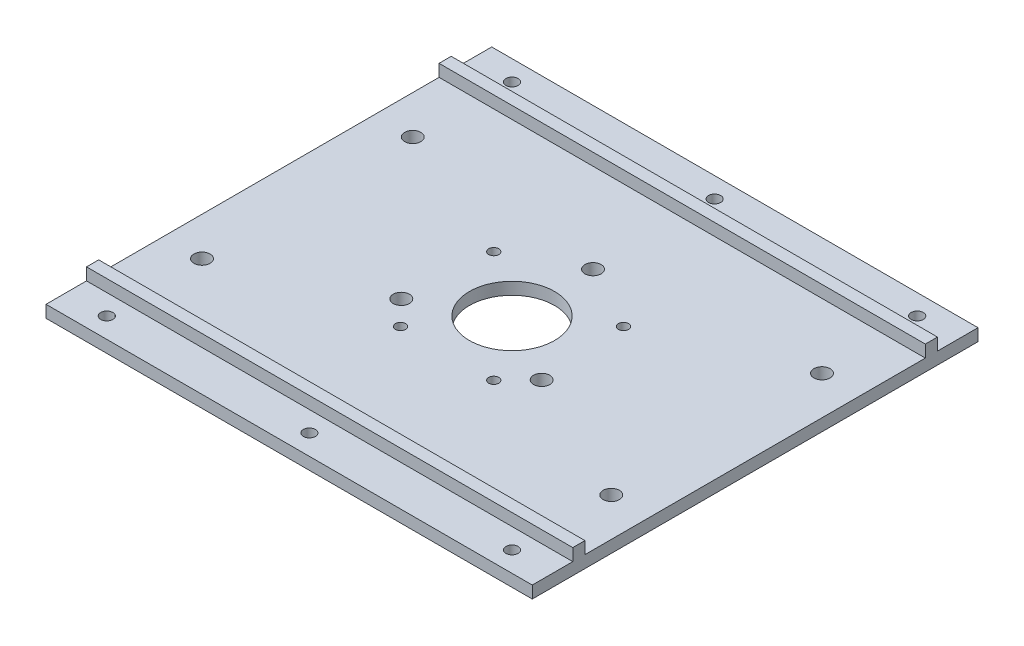
ISO-10303-21;
HEADER;
FILE_DESCRIPTION(('STEP AP214'),'2;1');
FILE_NAME('part.step','',(''),(''),'','','');
FILE_SCHEMA(('AUTOMOTIVE_DESIGN { 1 0 10303 214 1 1 1 1 }'));
ENDSEC;
DATA;
#1=APPLICATION_CONTEXT('core data for automotive mechanical design processes');
#2=APPLICATION_PROTOCOL_DEFINITION('international standard','automotive_design',2000,#1);
#3=PRODUCT_CONTEXT('',#1,'mechanical');
#4=PRODUCT('Part','Part','',(#3));
#5=PRODUCT_RELATED_PRODUCT_CATEGORY('part','',(#4));
#6=PRODUCT_DEFINITION_FORMATION('','',#4);
#7=PRODUCT_DEFINITION_CONTEXT('part definition',#1,'design');
#8=PRODUCT_DEFINITION('design','',#6,#7);
#9=PRODUCT_DEFINITION_SHAPE('','',#8);
#10=(LENGTH_UNIT() NAMED_UNIT(*) SI_UNIT(.MILLI.,.METRE.));
#11=(NAMED_UNIT(*) PLANE_ANGLE_UNIT() SI_UNIT($,.RADIAN.));
#12=(NAMED_UNIT(*) SI_UNIT($,.STERADIAN.) SOLID_ANGLE_UNIT());
#13=UNCERTAINTY_MEASURE_WITH_UNIT(LENGTH_MEASURE(1.E-05),#10,'distance_accuracy_value','');
#14=(GEOMETRIC_REPRESENTATION_CONTEXT(3) GLOBAL_UNCERTAINTY_ASSIGNED_CONTEXT((#13)) GLOBAL_UNIT_ASSIGNED_CONTEXT((#10,
#11,#12)) REPRESENTATION_CONTEXT('',''));
#15=CARTESIAN_POINT('',(0.,0.,0.));
#16=DIRECTION('',(0.,0.,1.));
#17=DIRECTION('',(1.,0.,0.));
#18=AXIS2_PLACEMENT_3D('',#15,#16,#17);
#19=CARTESIAN_POINT('',(0.,3.,0.));
#20=DIRECTION('',(0.,1.,0.));
#21=DIRECTION('',(0.,0.,1.));
#22=AXIS2_PLACEMENT_3D('',#19,#20,#21);
#23=PLANE('',#22);
#24=DIRECTION('',(0.,0.,1.));
#25=VECTOR('',#24,1.);
#26=CARTESIAN_POINT('',(-60.,3.,-70.));
#27=LINE('',#26,#25);
#28=CARTESIAN_POINT('',(-60.,3.,55.));
#29=VERTEX_POINT('',#28);
#30=CARTESIAN_POINT('',(-60.,3.,45.));
#31=VERTEX_POINT('',#30);
#32=EDGE_CURVE('E109',#29,#31,#27,.F.);
#33=ORIENTED_EDGE('',*,*,#32,.F.);
#34=DIRECTION('',(-1.,0.,0.));
#35=VECTOR('',#34,1.);
#36=CARTESIAN_POINT('',(-60.,3.,55.));
#37=LINE('',#36,#35);
#38=CARTESIAN_POINT('',(60.,3.,55.));
#39=VERTEX_POINT('',#38);
#40=EDGE_CURVE('E644',#29,#39,#37,.F.);
#41=ORIENTED_EDGE('',*,*,#40,.T.);
#42=DIRECTION('',(0.,0.,-1.));
#43=VECTOR('',#42,1.);
#44=CARTESIAN_POINT('',(60.,3.,70.));
#45=LINE('',#44,#43);
#46=CARTESIAN_POINT('',(60.,3.,45.));
#47=VERTEX_POINT('',#46);
#48=EDGE_CURVE('E125',#47,#39,#45,.F.);
#49=ORIENTED_EDGE('',*,*,#48,.F.);
#50=DIRECTION('',(-1.,0.,0.));
#51=VECTOR('',#50,1.);
#52=CARTESIAN_POINT('',(60.,3.,45.));
#53=LINE('',#52,#51);
#54=EDGE_CURVE('E123',#47,#31,#53,.T.);
#55=ORIENTED_EDGE('',*,*,#54,.T.);
#56=EDGE_LOOP('',(#33,#41,#49,#55));
#57=FACE_BOUND('',#56,.T.);
#58=CARTESIAN_POINT('',(-50.,3.,50.));
#59=DIRECTION('',(0.,1.,0.));
#60=DIRECTION('',(0.,0.,1.));
#61=AXIS2_PLACEMENT_3D('',#58,#59,#60);
#62=CIRCLE('',#61,1.49999999999999);
#63=CARTESIAN_POINT('',(-50.,3.,51.5));
#64=VERTEX_POINT('',#63);
#65=EDGE_CURVE('E20',#64,#64,#62,.F.);
#66=ORIENTED_EDGE('',*,*,#65,.T.);
#67=EDGE_LOOP('',(#66));
#68=FACE_BOUND('',#67,.T.);
#69=CARTESIAN_POINT('',(0.,3.,50.));
#70=DIRECTION('',(0.,1.,0.));
#71=DIRECTION('',(0.,0.,1.));
#72=AXIS2_PLACEMENT_3D('',#69,#70,#71);
#73=CIRCLE('',#72,1.49999999999999);
#74=CARTESIAN_POINT('',(0.,3.,51.5));
#75=VERTEX_POINT('',#74);
#76=EDGE_CURVE('E252',#75,#75,#73,.F.);
#77=ORIENTED_EDGE('',*,*,#76,.T.);
#78=EDGE_LOOP('',(#77));
#79=FACE_BOUND('',#78,.T.);
#80=CARTESIAN_POINT('',(50.,3.,50.));
#81=DIRECTION('',(0.,1.,0.));
#82=DIRECTION('',(0.,0.,1.));
#83=AXIS2_PLACEMENT_3D('',#80,#81,#82);
#84=CIRCLE('',#83,1.49999999999999);
#85=CARTESIAN_POINT('',(50.,3.,51.5));
#86=VERTEX_POINT('',#85);
#87=EDGE_CURVE('E250',#86,#86,#84,.F.);
#88=ORIENTED_EDGE('',*,*,#87,.T.);
#89=EDGE_LOOP('',(#88));
#90=FACE_BOUND('',#89,.T.);
#91=ADVANCED_FACE('F17',(#57,#68,#79,#90),#23,.T.);
#92=CARTESIAN_POINT('',(0.,3.,0.));
#93=DIRECTION('',(0.,1.,0.));
#94=DIRECTION('',(0.,0.,1.));
#95=AXIS2_PLACEMENT_3D('',#92,#93,#94);
#96=PLANE('',#95);
#97=CARTESIAN_POINT('',(-50.,3.,-50.));
#98=DIRECTION('',(0.,1.,0.));
#99=DIRECTION('',(0.,0.,1.));
#100=AXIS2_PLACEMENT_3D('',#97,#98,#99);
#101=CIRCLE('',#100,1.49999999999999);
#102=CARTESIAN_POINT('',(-50.,3.,-48.5));
#103=VERTEX_POINT('',#102);
#104=EDGE_CURVE('E247',#103,#103,#101,.F.);
#105=ORIENTED_EDGE('',*,*,#104,.T.);
#106=EDGE_LOOP('',(#105));
#107=FACE_BOUND('',#106,.T.);
#108=CARTESIAN_POINT('',(0.,3.,-50.));
#109=DIRECTION('',(0.,1.,0.));
#110=DIRECTION('',(0.,0.,1.));
#111=AXIS2_PLACEMENT_3D('',#108,#109,#110);
#112=CIRCLE('',#111,1.49999999999999);
#113=CARTESIAN_POINT('',(0.,3.,-48.5));
#114=VERTEX_POINT('',#113);
#115=EDGE_CURVE('E244',#114,#114,#112,.F.);
#116=ORIENTED_EDGE('',*,*,#115,.T.);
#117=EDGE_LOOP('',(#116));
#118=FACE_BOUND('',#117,.T.);
#119=CARTESIAN_POINT('',(50.,3.,-50.));
#120=DIRECTION('',(0.,1.,0.));
#121=DIRECTION('',(0.,0.,1.));
#122=AXIS2_PLACEMENT_3D('',#119,#120,#121);
#123=CIRCLE('',#122,1.49999999999999);
#124=CARTESIAN_POINT('',(50.,3.,-48.5));
#125=VERTEX_POINT('',#124);
#126=EDGE_CURVE('E241',#125,#125,#123,.F.);
#127=ORIENTED_EDGE('',*,*,#126,.T.);
#128=EDGE_LOOP('',(#127));
#129=FACE_BOUND('',#128,.T.);
#130=DIRECTION('',(1.,0.,0.));
#131=VECTOR('',#130,1.);
#132=CARTESIAN_POINT('',(-60.,3.,-55.));
#133=LINE('',#132,#131);
#134=CARTESIAN_POINT('',(60.,3.,-55.));
#135=VERTEX_POINT('',#134);
#136=CARTESIAN_POINT('',(-60.,3.,-55.));
#137=VERTEX_POINT('',#136);
#138=EDGE_CURVE('E120',#135,#137,#133,.F.);
#139=ORIENTED_EDGE('',*,*,#138,.T.);
#140=DIRECTION('',(0.,0.,1.));
#141=VECTOR('',#140,1.);
#142=CARTESIAN_POINT('',(-60.,3.,-70.));
#143=LINE('',#142,#141);
#144=CARTESIAN_POINT('',(-60.,3.,-45.));
#145=VERTEX_POINT('',#144);
#146=EDGE_CURVE('E639',#145,#137,#143,.F.);
#147=ORIENTED_EDGE('',*,*,#146,.F.);
#148=DIRECTION('',(1.,0.,0.));
#149=VECTOR('',#148,1.);
#150=CARTESIAN_POINT('',(-60.,3.,-45.));
#151=LINE('',#150,#149);
#152=CARTESIAN_POINT('',(60.,3.,-45.));
#153=VERTEX_POINT('',#152);
#154=EDGE_CURVE('E150',#145,#153,#151,.T.);
#155=ORIENTED_EDGE('',*,*,#154,.T.);
#156=DIRECTION('',(0.,0.,-1.));
#157=VECTOR('',#156,1.);
#158=CARTESIAN_POINT('',(60.,3.,70.));
#159=LINE('',#158,#157);
#160=EDGE_CURVE('E651',#135,#153,#159,.F.);
#161=ORIENTED_EDGE('',*,*,#160,.F.);
#162=EDGE_LOOP('',(#139,#147,#155,#161));
#163=FACE_BOUND('',#162,.T.);
#164=ADVANCED_FACE('F366',(#107,#118,#129,#163),#96,.T.);
#165=CARTESIAN_POINT('',(-60.,6.,-45.));
#166=DIRECTION('',(0.,0.,1.));
#167=DIRECTION('',(1.,0.,0.));
#168=AXIS2_PLACEMENT_3D('',#165,#166,#167);
#169=PLANE('',#168);
#170=DIRECTION('',(0.,1.,0.));
#171=VECTOR('',#170,1.);
#172=CARTESIAN_POINT('',(-60.,0.,-45.));
#173=LINE('',#172,#171);
#174=CARTESIAN_POINT('',(-60.,6.,-45.));
#175=VERTEX_POINT('',#174);
#176=EDGE_CURVE('E636',#175,#145,#173,.F.);
#177=ORIENTED_EDGE('',*,*,#176,.F.);
#178=DIRECTION('',(1.,0.,0.));
#179=VECTOR('',#178,1.);
#180=CARTESIAN_POINT('',(0.,6.,-45.));
#181=LINE('',#180,#179);
#182=CARTESIAN_POINT('',(60.,6.,-45.));
#183=VERTEX_POINT('',#182);
#184=EDGE_CURVE('E148',#183,#175,#181,.F.);
#185=ORIENTED_EDGE('',*,*,#184,.F.);
#186=DIRECTION('',(0.,1.,0.));
#187=VECTOR('',#186,1.);
#188=CARTESIAN_POINT('',(60.,0.,-45.));
#189=LINE('',#188,#187);
#190=EDGE_CURVE('E653',#153,#183,#189,.T.);
#191=ORIENTED_EDGE('',*,*,#190,.F.);
#192=ORIENTED_EDGE('',*,*,#154,.F.);
#193=EDGE_LOOP('',(#177,#185,#191,#192));
#194=FACE_BOUND('',#193,.T.);
#195=ADVANCED_FACE('F370',(#194),#169,.F.);
#196=CARTESIAN_POINT('',(0.,6.,0.));
#197=DIRECTION('',(0.,1.,0.));
#198=DIRECTION('',(0.,0.,1.));
#199=AXIS2_PLACEMENT_3D('',#196,#197,#198);
#200=PLANE('',#199);
#201=DIRECTION('',(0.,0.,-1.));
#202=VECTOR('',#201,1.);
#203=CARTESIAN_POINT('',(60.,6.,70.));
#204=LINE('',#203,#202);
#205=CARTESIAN_POINT('',(60.,6.,-42.));
#206=VERTEX_POINT('',#205);
#207=EDGE_CURVE('E655',#183,#206,#204,.F.);
#208=ORIENTED_EDGE('',*,*,#207,.F.);
#209=ORIENTED_EDGE('',*,*,#184,.T.);
#210=DIRECTION('',(0.,0.,1.));
#211=VECTOR('',#210,1.);
#212=CARTESIAN_POINT('',(-60.,6.,-70.));
#213=LINE('',#212,#211);
#214=CARTESIAN_POINT('',(-60.,6.,-42.));
#215=VERTEX_POINT('',#214);
#216=EDGE_CURVE('E633',#215,#175,#213,.F.);
#217=ORIENTED_EDGE('',*,*,#216,.F.);
#218=DIRECTION('',(-1.,0.,0.));
#219=VECTOR('',#218,1.);
#220=CARTESIAN_POINT('',(-60.,6.,-42.));
#221=LINE('',#220,#219);
#222=EDGE_CURVE('E145',#215,#206,#221,.F.);
#223=ORIENTED_EDGE('',*,*,#222,.T.);
#224=EDGE_LOOP('',(#208,#209,#217,#223));
#225=FACE_BOUND('',#224,.T.);
#226=ADVANCED_FACE('F375',(#225),#200,.T.);
#227=CARTESIAN_POINT('',(-60.,6.,-42.));
#228=DIRECTION('',(0.,0.,-1.));
#229=DIRECTION('',(-1.,0.,0.));
#230=AXIS2_PLACEMENT_3D('',#227,#228,#229);
#231=PLANE('',#230);
#232=DIRECTION('',(0.,1.,0.));
#233=VECTOR('',#232,1.);
#234=CARTESIAN_POINT('',(60.,0.,-42.));
#235=LINE('',#234,#233);
#236=CARTESIAN_POINT('',(60.,3.,-42.));
#237=VERTEX_POINT('',#236);
#238=EDGE_CURVE('E657',#206,#237,#235,.F.);
#239=ORIENTED_EDGE('',*,*,#238,.F.);
#240=ORIENTED_EDGE('',*,*,#222,.F.);
#241=DIRECTION('',(0.,1.,0.));
#242=VECTOR('',#241,1.);
#243=CARTESIAN_POINT('',(-60.,0.,-42.));
#244=LINE('',#243,#242);
#245=CARTESIAN_POINT('',(-60.,3.,-42.));
#246=VERTEX_POINT('',#245);
#247=EDGE_CURVE('E628',#246,#215,#244,.T.);
#248=ORIENTED_EDGE('',*,*,#247,.F.);
#249=DIRECTION('',(1.,0.,0.));
#250=VECTOR('',#249,1.);
#251=CARTESIAN_POINT('',(0.,3.,-42.));
#252=LINE('',#251,#250);
#253=EDGE_CURVE('E139',#237,#246,#252,.F.);
#254=ORIENTED_EDGE('',*,*,#253,.F.);
#255=EDGE_LOOP('',(#239,#240,#248,#254));
#256=FACE_BOUND('',#255,.T.);
#257=ADVANCED_FACE('F382',(#256),#231,.F.);
#258=CARTESIAN_POINT('',(60.,6.,42.));
#259=DIRECTION('',(0.,0.,1.));
#260=DIRECTION('',(1.,0.,0.));
#261=AXIS2_PLACEMENT_3D('',#258,#259,#260);
#262=PLANE('',#261);
#263=DIRECTION('',(0.,1.,0.));
#264=VECTOR('',#263,1.);
#265=CARTESIAN_POINT('',(-60.,0.,42.));
#266=LINE('',#265,#264);
#267=CARTESIAN_POINT('',(-60.,6.,42.));
#268=VERTEX_POINT('',#267);
#269=CARTESIAN_POINT('',(-60.,3.,42.));
#270=VERTEX_POINT('',#269);
#271=EDGE_CURVE('E132',#268,#270,#266,.F.);
#272=ORIENTED_EDGE('',*,*,#271,.F.);
#273=DIRECTION('',(1.,0.,0.));
#274=VECTOR('',#273,1.);
#275=CARTESIAN_POINT('',(0.,6.,42.));
#276=LINE('',#275,#274);
#277=CARTESIAN_POINT('',(60.,6.,42.));
#278=VERTEX_POINT('',#277);
#279=EDGE_CURVE('E143',#278,#268,#276,.F.);
#280=ORIENTED_EDGE('',*,*,#279,.F.);
#281=DIRECTION('',(0.,1.,0.));
#282=VECTOR('',#281,1.);
#283=CARTESIAN_POINT('',(60.,0.,42.));
#284=LINE('',#283,#282);
#285=CARTESIAN_POINT('',(60.,3.,42.));
#286=VERTEX_POINT('',#285);
#287=EDGE_CURVE('E662',#286,#278,#284,.T.);
#288=ORIENTED_EDGE('',*,*,#287,.F.);
#289=DIRECTION('',(1.,0.,0.));
#290=VECTOR('',#289,1.);
#291=CARTESIAN_POINT('',(0.,3.,42.));
#292=LINE('',#291,#290);
#293=EDGE_CURVE('E127',#270,#286,#292,.T.);
#294=ORIENTED_EDGE('',*,*,#293,.F.);
#295=EDGE_LOOP('',(#272,#280,#288,#294));
#296=FACE_BOUND('',#295,.T.);
#297=ADVANCED_FACE('F386',(#296),#262,.F.);
#298=CARTESIAN_POINT('',(0.,6.,0.));
#299=DIRECTION('',(0.,1.,0.));
#300=DIRECTION('',(0.,0.,1.));
#301=AXIS2_PLACEMENT_3D('',#298,#299,#300);
#302=PLANE('',#301);
#303=DIRECTION('',(0.,0.,1.));
#304=VECTOR('',#303,1.);
#305=CARTESIAN_POINT('',(-60.,6.,-70.));
#306=LINE('',#305,#304);
#307=CARTESIAN_POINT('',(-60.,6.,45.));
#308=VERTEX_POINT('',#307);
#309=EDGE_CURVE('E130',#308,#268,#306,.F.);
#310=ORIENTED_EDGE('',*,*,#309,.F.);
#311=DIRECTION('',(-1.,0.,0.));
#312=VECTOR('',#311,1.);
#313=CARTESIAN_POINT('',(60.,6.,45.));
#314=LINE('',#313,#312);
#315=CARTESIAN_POINT('',(60.,6.,45.));
#316=VERTEX_POINT('',#315);
#317=EDGE_CURVE('E104',#308,#316,#314,.F.);
#318=ORIENTED_EDGE('',*,*,#317,.T.);
#319=DIRECTION('',(0.,0.,-1.));
#320=VECTOR('',#319,1.);
#321=CARTESIAN_POINT('',(60.,6.,70.));
#322=LINE('',#321,#320);
#323=EDGE_CURVE('E664',#278,#316,#322,.F.);
#324=ORIENTED_EDGE('',*,*,#323,.F.);
#325=ORIENTED_EDGE('',*,*,#279,.T.);
#326=EDGE_LOOP('',(#310,#318,#324,#325));
#327=FACE_BOUND('',#326,.T.);
#328=ADVANCED_FACE('F390',(#327),#302,.T.);
#329=CARTESIAN_POINT('',(60.,6.,45.));
#330=DIRECTION('',(0.,0.,-1.));
#331=DIRECTION('',(-1.,0.,0.));
#332=AXIS2_PLACEMENT_3D('',#329,#330,#331);
#333=PLANE('',#332);
#334=DIRECTION('',(0.,1.,0.));
#335=VECTOR('',#334,1.);
#336=CARTESIAN_POINT('',(60.,0.,45.));
#337=LINE('',#336,#335);
#338=EDGE_CURVE('E229',#316,#47,#337,.F.);
#339=ORIENTED_EDGE('',*,*,#338,.F.);
#340=ORIENTED_EDGE('',*,*,#317,.F.);
#341=DIRECTION('',(0.,1.,0.));
#342=VECTOR('',#341,1.);
#343=CARTESIAN_POINT('',(-60.,0.,45.));
#344=LINE('',#343,#342);
#345=EDGE_CURVE('E113',#31,#308,#344,.T.);
#346=ORIENTED_EDGE('',*,*,#345,.F.);
#347=ORIENTED_EDGE('',*,*,#54,.F.);
#348=EDGE_LOOP('',(#339,#340,#346,#347));
#349=FACE_BOUND('',#348,.T.);
#350=ADVANCED_FACE('F129',(#349),#333,.F.);
#351=CARTESIAN_POINT('',(0.,3.,0.));
#352=DIRECTION('',(0.,1.,0.));
#353=DIRECTION('',(0.,0.,1.));
#354=AXIS2_PLACEMENT_3D('',#351,#352,#353);
#355=PLANE('',#354);
#356=DIRECTION('',(0.,0.,-1.));
#357=VECTOR('',#356,1.);
#358=CARTESIAN_POINT('',(60.,3.,70.));
#359=LINE('',#358,#357);
#360=EDGE_CURVE('E659',#237,#286,#359,.F.);
#361=ORIENTED_EDGE('',*,*,#360,.F.);
#362=ORIENTED_EDGE('',*,*,#253,.T.);
#363=DIRECTION('',(0.,0.,1.));
#364=VECTOR('',#363,1.);
#365=CARTESIAN_POINT('',(-60.,3.,-70.));
#366=LINE('',#365,#364);
#367=EDGE_CURVE('E627',#270,#246,#366,.F.);
#368=ORIENTED_EDGE('',*,*,#367,.F.);
#369=ORIENTED_EDGE('',*,*,#293,.T.);
#370=EDGE_LOOP('',(#361,#362,#368,#369));
#371=FACE_BOUND('',#370,.T.);
#372=CARTESIAN_POINT('',(-50.498923811909,3.,-26.0020901821166));
#373=DIRECTION('',(0.,1.,0.));
#374=DIRECTION('',(0.,0.,1.));
#375=AXIS2_PLACEMENT_3D('',#372,#373,#374);
#376=CIRCLE('',#375,1.99999999999999);
#377=CARTESIAN_POINT('',(-50.498923811909,3.,-24.0020901821166));
#378=VERTEX_POINT('',#377);
#379=EDGE_CURVE('E238',#378,#378,#376,.F.);
#380=ORIENTED_EDGE('',*,*,#379,.T.);
#381=EDGE_LOOP('',(#380));
#382=FACE_BOUND('',#381,.T.);
#383=CARTESIAN_POINT('',(-50.5010761015758,3.,25.9979097733416));
#384=DIRECTION('',(0.,1.,0.));
#385=DIRECTION('',(0.,0.,1.));
#386=AXIS2_PLACEMENT_3D('',#383,#384,#385);
#387=CIRCLE('',#386,1.99999999999999);
#388=CARTESIAN_POINT('',(-50.5010761015758,3.,27.9979097733416));
#389=VERTEX_POINT('',#388);
#390=EDGE_CURVE('E235',#389,#389,#387,.F.);
#391=ORIENTED_EDGE('',*,*,#390,.T.);
#392=EDGE_LOOP('',(#391));
#393=FACE_BOUND('',#392,.T.);
#394=CARTESIAN_POINT('',(50.5010761015771,3.,-25.9979097733407));
#395=DIRECTION('',(0.,1.,0.));
#396=DIRECTION('',(0.,0.,1.));
#397=AXIS2_PLACEMENT_3D('',#394,#395,#396);
#398=CIRCLE('',#397,1.99999999999999);
#399=CARTESIAN_POINT('',(50.5010761015771,3.,-23.9979097733407));
#400=VERTEX_POINT('',#399);
#401=EDGE_CURVE('E232',#400,#400,#398,.F.);
#402=ORIENTED_EDGE('',*,*,#401,.T.);
#403=EDGE_LOOP('',(#402));
#404=FACE_BOUND('',#403,.T.);
#405=CARTESIAN_POINT('',(50.4989238119103,3.,26.0020901821175));
#406=DIRECTION('',(0.,1.,0.));
#407=DIRECTION('',(0.,0.,1.));
#408=AXIS2_PLACEMENT_3D('',#405,#406,#407);
#409=CIRCLE('',#408,1.99999999999999);
#410=CARTESIAN_POINT('',(50.4989238119103,3.,28.0020901821175));
#411=VERTEX_POINT('',#410);
#412=EDGE_CURVE('E138',#411,#411,#409,.F.);
#413=ORIENTED_EDGE('',*,*,#412,.T.);
#414=EDGE_LOOP('',(#413));
#415=FACE_BOUND('',#414,.T.);
#416=CARTESIAN_POINT('',(16.,3.,-11.5));
#417=DIRECTION('',(0.,-1.,0.));
#418=DIRECTION('',(0.,0.,-1.));
#419=AXIS2_PLACEMENT_3D('',#416,#417,#418);
#420=CIRCLE('',#419,1.24999999999999);
#421=CARTESIAN_POINT('',(16.,3.,-12.75));
#422=VERTEX_POINT('',#421);
#423=EDGE_CURVE('E226',#422,#422,#420,.T.);
#424=ORIENTED_EDGE('',*,*,#423,.T.);
#425=EDGE_LOOP('',(#424));
#426=FACE_BOUND('',#425,.T.);
#427=CARTESIAN_POINT('',(11.5,3.,16.));
#428=DIRECTION('',(0.,-1.,0.));
#429=DIRECTION('',(0.,0.,-1.));
#430=AXIS2_PLACEMENT_3D('',#427,#428,#429);
#431=CIRCLE('',#430,1.24999999999999);
#432=CARTESIAN_POINT('',(11.5,3.,14.75));
#433=VERTEX_POINT('',#432);
#434=EDGE_CURVE('E205',#433,#433,#431,.T.);
#435=ORIENTED_EDGE('',*,*,#434,.T.);
#436=EDGE_LOOP('',(#435));
#437=FACE_BOUND('',#436,.T.);
#438=CARTESIAN_POINT('',(-16.,3.,-11.5));
#439=DIRECTION('',(0.,-1.,0.));
#440=DIRECTION('',(0.,0.,-1.));
#441=AXIS2_PLACEMENT_3D('',#438,#439,#440);
#442=CIRCLE('',#441,1.24999999999999);
#443=CARTESIAN_POINT('',(-16.,3.,-12.75));
#444=VERTEX_POINT('',#443);
#445=EDGE_CURVE('E223',#444,#444,#442,.T.);
#446=ORIENTED_EDGE('',*,*,#445,.T.);
#447=EDGE_LOOP('',(#446));
#448=FACE_BOUND('',#447,.T.);
#449=CARTESIAN_POINT('',(-11.5,3.,16.));
#450=DIRECTION('',(0.,-1.,0.));
#451=DIRECTION('',(0.,0.,-1.));
#452=AXIS2_PLACEMENT_3D('',#449,#450,#451);
#453=CIRCLE('',#452,1.24999999999999);
#454=CARTESIAN_POINT('',(-11.5,3.,14.75));
#455=VERTEX_POINT('',#454);
#456=EDGE_CURVE('E220',#455,#455,#453,.T.);
#457=ORIENTED_EDGE('',*,*,#456,.T.);
#458=EDGE_LOOP('',(#457));
#459=FACE_BOUND('',#458,.T.);
#460=CARTESIAN_POINT('',(0.,3.,0.));
#461=DIRECTION('',(0.,-1.,0.));
#462=DIRECTION('',(0.,0.,-1.));
#463=AXIS2_PLACEMENT_3D('',#460,#461,#462);
#464=CIRCLE('',#463,10.5);
#465=CARTESIAN_POINT('',(0.,3.,-10.5));
#466=VERTEX_POINT('',#465);
#467=EDGE_CURVE('E217',#466,#466,#464,.T.);
#468=ORIENTED_EDGE('',*,*,#467,.T.);
#469=EDGE_LOOP('',(#468));
#470=FACE_BOUND('',#469,.T.);
#471=CARTESIAN_POINT('',(17.317892481477,3.,9.99848988597786));
#472=DIRECTION('',(0.,-1.,0.));
#473=DIRECTION('',(0.,0.,-1.));
#474=AXIS2_PLACEMENT_3D('',#471,#472,#473);
#475=CIRCLE('',#474,2.);
#476=CARTESIAN_POINT('',(17.317892481477,3.,7.99848988597786));
#477=VERTEX_POINT('',#476);
#478=EDGE_CURVE('E214',#477,#477,#475,.T.);
#479=ORIENTED_EDGE('',*,*,#478,.T.);
#480=EDGE_LOOP('',(#479));
#481=FACE_BOUND('',#480,.T.);
#482=CARTESIAN_POINT('',(-17.3178924814763,3.,9.99848988597721));
#483=DIRECTION('',(0.,-1.,0.));
#484=DIRECTION('',(0.,0.,-1.));
#485=AXIS2_PLACEMENT_3D('',#482,#483,#484);
#486=CIRCLE('',#485,2.00000000000036);
#487=CARTESIAN_POINT('',(-17.3178924814763,3.,7.99848988597685));
#488=VERTEX_POINT('',#487);
#489=EDGE_CURVE('E211',#488,#488,#486,.T.);
#490=ORIENTED_EDGE('',*,*,#489,.T.);
#491=EDGE_LOOP('',(#490));
#492=FACE_BOUND('',#491,.T.);
#493=CARTESIAN_POINT('',(9.53264257364034E-13,3.,-19.9969797719551));
#494=DIRECTION('',(0.,-1.,0.));
#495=DIRECTION('',(0.,0.,-1.));
#496=AXIS2_PLACEMENT_3D('',#493,#494,#495);
#497=CIRCLE('',#496,1.99999999999923);
#498=CARTESIAN_POINT('',(9.53264257364034E-13,3.,-21.9969797719543));
#499=VERTEX_POINT('',#498);
#500=EDGE_CURVE('E208',#499,#499,#497,.T.);
#501=ORIENTED_EDGE('',*,*,#500,.T.);
#502=EDGE_LOOP('',(#501));
#503=FACE_BOUND('',#502,.T.);
#504=ADVANCED_FACE('F262',(#371,#382,#393,#404,#415,#426,#437,#448,#459,#470,#481,#492,#503),
#355,.T.);
#505=CARTESIAN_POINT('',(-50.,3.,50.));
#506=DIRECTION('',(0.,1.,0.));
#507=DIRECTION('',(0.,0.,1.));
#508=AXIS2_PLACEMENT_3D('',#505,#506,#507);
#509=CYLINDRICAL_SURFACE('',#508,1.49999999999999);
#510=CARTESIAN_POINT('',(-50.,0.,50.));
#511=DIRECTION('',(0.,1.,0.));
#512=DIRECTION('',(0.,0.,1.));
#513=AXIS2_PLACEMENT_3D('',#510,#511,#512);
#514=CIRCLE('',#513,1.49999999999999);
#515=CARTESIAN_POINT('',(-50.,0.,51.5));
#516=VERTEX_POINT('',#515);
#517=EDGE_CURVE('E202',#516,#516,#514,.F.);
#518=ORIENTED_EDGE('',*,*,#517,.T.);
#519=EDGE_LOOP('',(#518));
#520=FACE_BOUND('',#519,.T.);
#521=ORIENTED_EDGE('',*,*,#65,.F.);
#522=EDGE_LOOP('',(#521));
#523=FACE_BOUND('',#522,.T.);
#524=ADVANCED_FACE('F259',(#520,#523),#509,.F.);
#525=CARTESIAN_POINT('',(0.,3.,50.));
#526=DIRECTION('',(0.,1.,0.));
#527=DIRECTION('',(0.,0.,1.));
#528=AXIS2_PLACEMENT_3D('',#525,#526,#527);
#529=CYLINDRICAL_SURFACE('',#528,1.49999999999999);
#530=CARTESIAN_POINT('',(0.,0.,50.));
#531=DIRECTION('',(0.,1.,0.));
#532=DIRECTION('',(0.,0.,1.));
#533=AXIS2_PLACEMENT_3D('',#530,#531,#532);
#534=CIRCLE('',#533,1.49999999999999);
#535=CARTESIAN_POINT('',(0.,0.,51.5));
#536=VERTEX_POINT('',#535);
#537=EDGE_CURVE('E199',#536,#536,#534,.F.);
#538=ORIENTED_EDGE('',*,*,#537,.T.);
#539=EDGE_LOOP('',(#538));
#540=FACE_BOUND('',#539,.T.);
#541=ORIENTED_EDGE('',*,*,#76,.F.);
#542=EDGE_LOOP('',(#541));
#543=FACE_BOUND('',#542,.T.);
#544=ADVANCED_FACE('F261',(#540,#543),#529,.F.);
#545=CARTESIAN_POINT('',(50.,3.,50.));
#546=DIRECTION('',(0.,1.,0.));
#547=DIRECTION('',(0.,0.,1.));
#548=AXIS2_PLACEMENT_3D('',#545,#546,#547);
#549=CYLINDRICAL_SURFACE('',#548,1.49999999999999);
#550=CARTESIAN_POINT('',(50.,0.,50.));
#551=DIRECTION('',(0.,1.,0.));
#552=DIRECTION('',(0.,0.,1.));
#553=AXIS2_PLACEMENT_3D('',#550,#551,#552);
#554=CIRCLE('',#553,1.49999999999999);
#555=CARTESIAN_POINT('',(50.,0.,51.5));
#556=VERTEX_POINT('',#555);
#557=EDGE_CURVE('E196',#556,#556,#554,.F.);
#558=ORIENTED_EDGE('',*,*,#557,.T.);
#559=EDGE_LOOP('',(#558));
#560=FACE_BOUND('',#559,.T.);
#561=ORIENTED_EDGE('',*,*,#87,.F.);
#562=EDGE_LOOP('',(#561));
#563=FACE_BOUND('',#562,.T.);
#564=ADVANCED_FACE('F270',(#560,#563),#549,.F.);
#565=CARTESIAN_POINT('',(-50.,3.,-50.));
#566=DIRECTION('',(0.,1.,0.));
#567=DIRECTION('',(0.,0.,1.));
#568=AXIS2_PLACEMENT_3D('',#565,#566,#567);
#569=CYLINDRICAL_SURFACE('',#568,1.49999999999999);
#570=CARTESIAN_POINT('',(-50.,0.,-50.));
#571=DIRECTION('',(0.,1.,0.));
#572=DIRECTION('',(0.,0.,1.));
#573=AXIS2_PLACEMENT_3D('',#570,#571,#572);
#574=CIRCLE('',#573,1.49999999999999);
#575=CARTESIAN_POINT('',(-50.,0.,-48.5));
#576=VERTEX_POINT('',#575);
#577=EDGE_CURVE('E193',#576,#576,#574,.F.);
#578=ORIENTED_EDGE('',*,*,#577,.T.);
#579=EDGE_LOOP('',(#578));
#580=FACE_BOUND('',#579,.T.);
#581=ORIENTED_EDGE('',*,*,#104,.F.);
#582=EDGE_LOOP('',(#581));
#583=FACE_BOUND('',#582,.T.);
#584=ADVANCED_FACE('F352',(#580,#583),#569,.F.);
#585=CARTESIAN_POINT('',(0.,3.,-50.));
#586=DIRECTION('',(0.,1.,0.));
#587=DIRECTION('',(0.,0.,1.));
#588=AXIS2_PLACEMENT_3D('',#585,#586,#587);
#589=CYLINDRICAL_SURFACE('',#588,1.49999999999999);
#590=CARTESIAN_POINT('',(0.,0.,-50.));
#591=DIRECTION('',(0.,1.,0.));
#592=DIRECTION('',(0.,0.,1.));
#593=AXIS2_PLACEMENT_3D('',#590,#591,#592);
#594=CIRCLE('',#593,1.49999999999999);
#595=CARTESIAN_POINT('',(0.,0.,-48.5));
#596=VERTEX_POINT('',#595);
#597=EDGE_CURVE('E190',#596,#596,#594,.F.);
#598=ORIENTED_EDGE('',*,*,#597,.T.);
#599=EDGE_LOOP('',(#598));
#600=FACE_BOUND('',#599,.T.);
#601=ORIENTED_EDGE('',*,*,#115,.F.);
#602=EDGE_LOOP('',(#601));
#603=FACE_BOUND('',#602,.T.);
#604=ADVANCED_FACE('F348',(#600,#603),#589,.F.);
#605=CARTESIAN_POINT('',(50.,3.,-50.));
#606=DIRECTION('',(0.,1.,0.));
#607=DIRECTION('',(0.,0.,1.));
#608=AXIS2_PLACEMENT_3D('',#605,#606,#607);
#609=CYLINDRICAL_SURFACE('',#608,1.49999999999999);
#610=CARTESIAN_POINT('',(50.,0.,-50.));
#611=DIRECTION('',(0.,1.,0.));
#612=DIRECTION('',(0.,0.,1.));
#613=AXIS2_PLACEMENT_3D('',#610,#611,#612);
#614=CIRCLE('',#613,1.49999999999999);
#615=CARTESIAN_POINT('',(50.,0.,-48.5));
#616=VERTEX_POINT('',#615);
#617=EDGE_CURVE('E187',#616,#616,#614,.F.);
#618=ORIENTED_EDGE('',*,*,#617,.T.);
#619=EDGE_LOOP('',(#618));
#620=FACE_BOUND('',#619,.T.);
#621=ORIENTED_EDGE('',*,*,#126,.F.);
#622=EDGE_LOOP('',(#621));
#623=FACE_BOUND('',#622,.T.);
#624=ADVANCED_FACE('F344',(#620,#623),#609,.F.);
#625=CARTESIAN_POINT('',(-50.498923811909,3.,-26.0020901821166));
#626=DIRECTION('',(0.,1.,0.));
#627=DIRECTION('',(0.,0.,1.));
#628=AXIS2_PLACEMENT_3D('',#625,#626,#627);
#629=CYLINDRICAL_SURFACE('',#628,1.99999999999999);
#630=CARTESIAN_POINT('',(-50.498923811909,0.,-26.0020901821166));
#631=DIRECTION('',(0.,1.,0.));
#632=DIRECTION('',(0.,0.,1.));
#633=AXIS2_PLACEMENT_3D('',#630,#631,#632);
#634=CIRCLE('',#633,1.99999999999999);
#635=CARTESIAN_POINT('',(-50.498923811909,0.,-24.0020901821166));
#636=VERTEX_POINT('',#635);
#637=EDGE_CURVE('E184',#636,#636,#634,.F.);
#638=ORIENTED_EDGE('',*,*,#637,.T.);
#639=EDGE_LOOP('',(#638));
#640=FACE_BOUND('',#639,.T.);
#641=ORIENTED_EDGE('',*,*,#379,.F.);
#642=EDGE_LOOP('',(#641));
#643=FACE_BOUND('',#642,.T.);
#644=ADVANCED_FACE('F340',(#640,#643),#629,.F.);
#645=CARTESIAN_POINT('',(-50.5010761015758,3.,25.9979097733416));
#646=DIRECTION('',(0.,1.,0.));
#647=DIRECTION('',(0.,0.,1.));
#648=AXIS2_PLACEMENT_3D('',#645,#646,#647);
#649=CYLINDRICAL_SURFACE('',#648,1.99999999999999);
#650=CARTESIAN_POINT('',(-50.5010761015758,0.,25.9979097733416));
#651=DIRECTION('',(0.,1.,0.));
#652=DIRECTION('',(0.,0.,1.));
#653=AXIS2_PLACEMENT_3D('',#650,#651,#652);
#654=CIRCLE('',#653,1.99999999999999);
#655=CARTESIAN_POINT('',(-50.5010761015758,0.,27.9979097733416));
#656=VERTEX_POINT('',#655);
#657=EDGE_CURVE('E181',#656,#656,#654,.F.);
#658=ORIENTED_EDGE('',*,*,#657,.T.);
#659=EDGE_LOOP('',(#658));
#660=FACE_BOUND('',#659,.T.);
#661=ORIENTED_EDGE('',*,*,#390,.F.);
#662=EDGE_LOOP('',(#661));
#663=FACE_BOUND('',#662,.T.);
#664=ADVANCED_FACE('F336',(#660,#663),#649,.F.);
#665=CARTESIAN_POINT('',(50.5010761015771,3.,-25.9979097733407));
#666=DIRECTION('',(0.,1.,0.));
#667=DIRECTION('',(0.,0.,1.));
#668=AXIS2_PLACEMENT_3D('',#665,#666,#667);
#669=CYLINDRICAL_SURFACE('',#668,1.99999999999999);
#670=CARTESIAN_POINT('',(50.5010761015771,0.,-25.9979097733407));
#671=DIRECTION('',(0.,1.,0.));
#672=DIRECTION('',(0.,0.,1.));
#673=AXIS2_PLACEMENT_3D('',#670,#671,#672);
#674=CIRCLE('',#673,1.99999999999999);
#675=CARTESIAN_POINT('',(50.5010761015771,0.,-23.9979097733407));
#676=VERTEX_POINT('',#675);
#677=EDGE_CURVE('E178',#676,#676,#674,.F.);
#678=ORIENTED_EDGE('',*,*,#677,.T.);
#679=EDGE_LOOP('',(#678));
#680=FACE_BOUND('',#679,.T.);
#681=ORIENTED_EDGE('',*,*,#401,.F.);
#682=EDGE_LOOP('',(#681));
#683=FACE_BOUND('',#682,.T.);
#684=ADVANCED_FACE('F332',(#680,#683),#669,.F.);
#685=CARTESIAN_POINT('',(50.4989238119103,3.,26.0020901821175));
#686=DIRECTION('',(0.,1.,0.));
#687=DIRECTION('',(0.,0.,1.));
#688=AXIS2_PLACEMENT_3D('',#685,#686,#687);
#689=CYLINDRICAL_SURFACE('',#688,1.99999999999999);
#690=CARTESIAN_POINT('',(50.4989238119103,0.,26.0020901821175));
#691=DIRECTION('',(0.,1.,0.));
#692=DIRECTION('',(0.,0.,1.));
#693=AXIS2_PLACEMENT_3D('',#690,#691,#692);
#694=CIRCLE('',#693,1.99999999999999);
#695=CARTESIAN_POINT('',(50.4989238119103,0.,28.0020901821175));
#696=VERTEX_POINT('',#695);
#697=EDGE_CURVE('E174',#696,#696,#694,.F.);
#698=ORIENTED_EDGE('',*,*,#697,.T.);
#699=EDGE_LOOP('',(#698));
#700=FACE_BOUND('',#699,.T.);
#701=ORIENTED_EDGE('',*,*,#412,.F.);
#702=EDGE_LOOP('',(#701));
#703=FACE_BOUND('',#702,.T.);
#704=ADVANCED_FACE('F328',(#700,#703),#689,.F.);
#705=CARTESIAN_POINT('',(-60.,3.,-55.));
#706=DIRECTION('',(0.,0.,1.));
#707=DIRECTION('',(1.,0.,0.));
#708=AXIS2_PLACEMENT_3D('',#705,#706,#707);
#709=PLANE('',#708);
#710=DIRECTION('',(0.,1.,0.));
#711=VECTOR('',#710,1.);
#712=CARTESIAN_POINT('',(-60.,0.,-55.));
#713=LINE('',#712,#711);
#714=CARTESIAN_POINT('',(-60.,0.,-55.));
#715=VERTEX_POINT('',#714);
#716=EDGE_CURVE('E641',#137,#715,#713,.F.);
#717=ORIENTED_EDGE('',*,*,#716,.F.);
#718=ORIENTED_EDGE('',*,*,#138,.F.);
#719=DIRECTION('',(0.,1.,0.));
#720=VECTOR('',#719,1.);
#721=CARTESIAN_POINT('',(60.,0.,-55.));
#722=LINE('',#721,#720);
#723=CARTESIAN_POINT('',(60.,0.,-55.));
#724=VERTEX_POINT('',#723);
#725=EDGE_CURVE('E648',#724,#135,#722,.T.);
#726=ORIENTED_EDGE('',*,*,#725,.F.);
#727=DIRECTION('',(1.,0.,0.));
#728=VECTOR('',#727,1.);
#729=CARTESIAN_POINT('',(0.,0.,-55.));
#730=LINE('',#729,#728);
#731=EDGE_CURVE('E177',#724,#715,#730,.F.);
#732=ORIENTED_EDGE('',*,*,#731,.T.);
#733=EDGE_LOOP('',(#717,#718,#726,#732));
#734=FACE_BOUND('',#733,.T.);
#735=ADVANCED_FACE('F325',(#734),#709,.F.);
#736=CARTESIAN_POINT('',(-60.,0.,-70.));
#737=DIRECTION('',(-1.,0.,0.));
#738=DIRECTION('',(0.,0.,1.));
#739=AXIS2_PLACEMENT_3D('',#736,#737,#738);
#740=PLANE('',#739);
#741=ORIENTED_EDGE('',*,*,#146,.T.);
#742=ORIENTED_EDGE('',*,*,#716,.T.);
#743=DIRECTION('',(0.,0.,1.));
#744=VECTOR('',#743,1.);
#745=CARTESIAN_POINT('',(-60.,0.,0.));
#746=LINE('',#745,#744);
#747=CARTESIAN_POINT('',(-60.,0.,55.));
#748=VERTEX_POINT('',#747);
#749=EDGE_CURVE('E669',#715,#748,#746,.T.);
#750=ORIENTED_EDGE('',*,*,#749,.T.);
#751=DIRECTION('',(0.,1.,0.));
#752=VECTOR('',#751,1.);
#753=CARTESIAN_POINT('',(-60.,3.,55.));
#754=LINE('',#753,#752);
#755=EDGE_CURVE('E116',#748,#29,#754,.T.);
#756=ORIENTED_EDGE('',*,*,#755,.T.);
#757=ORIENTED_EDGE('',*,*,#32,.T.);
#758=ORIENTED_EDGE('',*,*,#345,.T.);
#759=ORIENTED_EDGE('',*,*,#309,.T.);
#760=ORIENTED_EDGE('',*,*,#271,.T.);
#761=ORIENTED_EDGE('',*,*,#367,.T.);
#762=ORIENTED_EDGE('',*,*,#247,.T.);
#763=ORIENTED_EDGE('',*,*,#216,.T.);
#764=ORIENTED_EDGE('',*,*,#176,.T.);
#765=EDGE_LOOP('',(#741,#742,#750,#756,#757,#758,#759,#760,#761,#762,#763,#764));
#766=FACE_BOUND('',#765,.T.);
#767=ADVANCED_FACE('F111',(#766),#740,.T.);
#768=CARTESIAN_POINT('',(-60.,3.,55.));
#769=DIRECTION('',(0.,0.,-1.));
#770=DIRECTION('',(-1.,0.,0.));
#771=AXIS2_PLACEMENT_3D('',#768,#769,#770);
#772=PLANE('',#771);
#773=DIRECTION('',(0.,1.,0.));
#774=VECTOR('',#773,1.);
#775=CARTESIAN_POINT('',(60.,0.,55.));
#776=LINE('',#775,#774);
#777=CARTESIAN_POINT('',(60.,0.,55.));
#778=VERTEX_POINT('',#777);
#779=EDGE_CURVE('E35',#39,#778,#776,.F.);
#780=ORIENTED_EDGE('',*,*,#779,.F.);
#781=ORIENTED_EDGE('',*,*,#40,.F.);
#782=ORIENTED_EDGE('',*,*,#755,.F.);
#783=DIRECTION('',(1.,0.,0.));
#784=VECTOR('',#783,1.);
#785=CARTESIAN_POINT('',(0.,0.,55.));
#786=LINE('',#785,#784);
#787=EDGE_CURVE('E671',#748,#778,#786,.T.);
#788=ORIENTED_EDGE('',*,*,#787,.T.);
#789=EDGE_LOOP('',(#780,#781,#782,#788));
#790=FACE_BOUND('',#789,.T.);
#791=ADVANCED_FACE('F319',(#790),#772,.F.);
#792=CARTESIAN_POINT('',(60.,0.,70.));
#793=DIRECTION('',(1.,0.,0.));
#794=DIRECTION('',(0.,0.,-1.));
#795=AXIS2_PLACEMENT_3D('',#792,#793,#794);
#796=PLANE('',#795);
#797=ORIENTED_EDGE('',*,*,#323,.T.);
#798=ORIENTED_EDGE('',*,*,#338,.T.);
#799=ORIENTED_EDGE('',*,*,#48,.T.);
#800=ORIENTED_EDGE('',*,*,#779,.T.);
#801=DIRECTION('',(0.,0.,1.));
#802=VECTOR('',#801,1.);
#803=CARTESIAN_POINT('',(60.,0.,0.));
#804=LINE('',#803,#802);
#805=EDGE_CURVE('E173',#778,#724,#804,.F.);
#806=ORIENTED_EDGE('',*,*,#805,.T.);
#807=ORIENTED_EDGE('',*,*,#725,.T.);
#808=ORIENTED_EDGE('',*,*,#160,.T.);
#809=ORIENTED_EDGE('',*,*,#190,.T.);
#810=ORIENTED_EDGE('',*,*,#207,.T.);
#811=ORIENTED_EDGE('',*,*,#238,.T.);
#812=ORIENTED_EDGE('',*,*,#360,.T.);
#813=ORIENTED_EDGE('',*,*,#287,.T.);
#814=EDGE_LOOP('',(#797,#798,#799,#800,#806,#807,#808,#809,#810,#811,#812,#813));
#815=FACE_BOUND('',#814,.T.);
#816=ADVANCED_FACE('F315',(#815),#796,.T.);
#817=CARTESIAN_POINT('',(16.,0.,-11.5));
#818=DIRECTION('',(0.,-1.,0.));
#819=DIRECTION('',(0.,0.,-1.));
#820=AXIS2_PLACEMENT_3D('',#817,#818,#819);
#821=CYLINDRICAL_SURFACE('',#820,1.24999999999999);
#822=ORIENTED_EDGE('',*,*,#423,.F.);
#823=EDGE_LOOP('',(#822));
#824=FACE_BOUND('',#823,.T.);
#825=CARTESIAN_POINT('',(16.,0.,-11.5));
#826=DIRECTION('',(0.,-1.,0.));
#827=DIRECTION('',(0.,0.,-1.));
#828=AXIS2_PLACEMENT_3D('',#825,#826,#827);
#829=CIRCLE('',#828,1.24999999999999);
#830=CARTESIAN_POINT('',(16.,0.,-12.75));
#831=VERTEX_POINT('',#830);
#832=EDGE_CURVE('E170',#831,#831,#829,.T.);
#833=ORIENTED_EDGE('',*,*,#832,.T.);
#834=EDGE_LOOP('',(#833));
#835=FACE_BOUND('',#834,.T.);
#836=ADVANCED_FACE('F311',(#824,#835),#821,.F.);
#837=CARTESIAN_POINT('',(-16.,0.,-11.5));
#838=DIRECTION('',(0.,-1.,0.));
#839=DIRECTION('',(0.,0.,-1.));
#840=AXIS2_PLACEMENT_3D('',#837,#838,#839);
#841=CYLINDRICAL_SURFACE('',#840,1.24999999999999);
#842=ORIENTED_EDGE('',*,*,#445,.F.);
#843=EDGE_LOOP('',(#842));
#844=FACE_BOUND('',#843,.T.);
#845=CARTESIAN_POINT('',(-16.,0.,-11.5));
#846=DIRECTION('',(0.,-1.,0.));
#847=DIRECTION('',(0.,0.,-1.));
#848=AXIS2_PLACEMENT_3D('',#845,#846,#847);
#849=CIRCLE('',#848,1.24999999999999);
#850=CARTESIAN_POINT('',(-16.,0.,-12.75));
#851=VERTEX_POINT('',#850);
#852=EDGE_CURVE('E167',#851,#851,#849,.T.);
#853=ORIENTED_EDGE('',*,*,#852,.T.);
#854=EDGE_LOOP('',(#853));
#855=FACE_BOUND('',#854,.T.);
#856=ADVANCED_FACE('F307',(#844,#855),#841,.F.);
#857=CARTESIAN_POINT('',(-11.5,0.,16.));
#858=DIRECTION('',(0.,-1.,0.));
#859=DIRECTION('',(0.,0.,-1.));
#860=AXIS2_PLACEMENT_3D('',#857,#858,#859);
#861=CYLINDRICAL_SURFACE('',#860,1.24999999999999);
#862=ORIENTED_EDGE('',*,*,#456,.F.);
#863=EDGE_LOOP('',(#862));
#864=FACE_BOUND('',#863,.T.);
#865=CARTESIAN_POINT('',(-11.5,0.,16.));
#866=DIRECTION('',(0.,-1.,0.));
#867=DIRECTION('',(0.,0.,-1.));
#868=AXIS2_PLACEMENT_3D('',#865,#866,#867);
#869=CIRCLE('',#868,1.24999999999999);
#870=CARTESIAN_POINT('',(-11.5,0.,14.75));
#871=VERTEX_POINT('',#870);
#872=EDGE_CURVE('E164',#871,#871,#869,.T.);
#873=ORIENTED_EDGE('',*,*,#872,.T.);
#874=EDGE_LOOP('',(#873));
#875=FACE_BOUND('',#874,.T.);
#876=ADVANCED_FACE('F303',(#864,#875),#861,.F.);
#877=CARTESIAN_POINT('',(0.,10.,0.));
#878=DIRECTION('',(0.,-1.,0.));
#879=DIRECTION('',(0.,0.,-1.));
#880=AXIS2_PLACEMENT_3D('',#877,#878,#879);
#881=CYLINDRICAL_SURFACE('',#880,10.5);
#882=ORIENTED_EDGE('',*,*,#467,.F.);
#883=EDGE_LOOP('',(#882));
#884=FACE_BOUND('',#883,.T.);
#885=CARTESIAN_POINT('',(0.,0.,0.));
#886=DIRECTION('',(0.,-1.,0.));
#887=DIRECTION('',(0.,0.,-1.));
#888=AXIS2_PLACEMENT_3D('',#885,#886,#887);
#889=CIRCLE('',#888,10.5);
#890=CARTESIAN_POINT('',(0.,0.,-10.5));
#891=VERTEX_POINT('',#890);
#892=EDGE_CURVE('E161',#891,#891,#889,.T.);
#893=ORIENTED_EDGE('',*,*,#892,.T.);
#894=EDGE_LOOP('',(#893));
#895=FACE_BOUND('',#894,.T.);
#896=ADVANCED_FACE('F299',(#884,#895),#881,.F.);
#897=CARTESIAN_POINT('',(17.317892481477,3.,9.99848988597786));
#898=DIRECTION('',(0.,-1.,0.));
#899=DIRECTION('',(0.,0.,-1.));
#900=AXIS2_PLACEMENT_3D('',#897,#898,#899);
#901=CYLINDRICAL_SURFACE('',#900,2.);
#902=CARTESIAN_POINT('',(17.317892481477,0.,9.99848988597786));
#903=DIRECTION('',(0.,-1.,0.));
#904=DIRECTION('',(0.,0.,-1.));
#905=AXIS2_PLACEMENT_3D('',#902,#903,#904);
#906=CIRCLE('',#905,2.);
#907=CARTESIAN_POINT('',(17.317892481477,0.,7.99848988597786));
#908=VERTEX_POINT('',#907);
#909=EDGE_CURVE('E158',#908,#908,#906,.T.);
#910=ORIENTED_EDGE('',*,*,#909,.T.);
#911=EDGE_LOOP('',(#910));
#912=FACE_BOUND('',#911,.T.);
#913=ORIENTED_EDGE('',*,*,#478,.F.);
#914=EDGE_LOOP('',(#913));
#915=FACE_BOUND('',#914,.T.);
#916=ADVANCED_FACE('F295',(#912,#915),#901,.F.);
#917=CARTESIAN_POINT('',(-17.3178924814763,3.,9.99848988597721));
#918=DIRECTION('',(0.,-1.,0.));
#919=DIRECTION('',(0.,0.,-1.));
#920=AXIS2_PLACEMENT_3D('',#917,#918,#919);
#921=CYLINDRICAL_SURFACE('',#920,2.00000000000036);
#922=CARTESIAN_POINT('',(-17.3178924814763,0.,9.99848988597721));
#923=DIRECTION('',(0.,-1.,0.));
#924=DIRECTION('',(0.,0.,-1.));
#925=AXIS2_PLACEMENT_3D('',#922,#923,#924);
#926=CIRCLE('',#925,2.00000000000036);
#927=CARTESIAN_POINT('',(-17.3178924814763,0.,7.99848988597685));
#928=VERTEX_POINT('',#927);
#929=EDGE_CURVE('E155',#928,#928,#926,.T.);
#930=ORIENTED_EDGE('',*,*,#929,.T.);
#931=EDGE_LOOP('',(#930));
#932=FACE_BOUND('',#931,.T.);
#933=ORIENTED_EDGE('',*,*,#489,.F.);
#934=EDGE_LOOP('',(#933));
#935=FACE_BOUND('',#934,.T.);
#936=ADVANCED_FACE('F291',(#932,#935),#921,.F.);
#937=CARTESIAN_POINT('',(9.53264257364034E-13,3.,-19.9969797719551));
#938=DIRECTION('',(0.,-1.,0.));
#939=DIRECTION('',(0.,0.,-1.));
#940=AXIS2_PLACEMENT_3D('',#937,#938,#939);
#941=CYLINDRICAL_SURFACE('',#940,1.99999999999923);
#942=CARTESIAN_POINT('',(9.53264257364034E-13,0.,-19.9969797719551));
#943=DIRECTION('',(0.,-1.,0.));
#944=DIRECTION('',(0.,0.,-1.));
#945=AXIS2_PLACEMENT_3D('',#942,#943,#944);
#946=CIRCLE('',#945,1.99999999999923);
#947=CARTESIAN_POINT('',(9.53264257364034E-13,0.,-21.9969797719543));
#948=VERTEX_POINT('',#947);
#949=EDGE_CURVE('E26',#948,#948,#946,.T.);
#950=ORIENTED_EDGE('',*,*,#949,.T.);
#951=EDGE_LOOP('',(#950));
#952=FACE_BOUND('',#951,.T.);
#953=ORIENTED_EDGE('',*,*,#500,.F.);
#954=EDGE_LOOP('',(#953));
#955=FACE_BOUND('',#954,.T.);
#956=ADVANCED_FACE('F283',(#952,#955),#941,.F.);
#957=CARTESIAN_POINT('',(11.5,0.,16.));
#958=DIRECTION('',(0.,-1.,0.));
#959=DIRECTION('',(0.,0.,-1.));
#960=AXIS2_PLACEMENT_3D('',#957,#958,#959);
#961=CYLINDRICAL_SURFACE('',#960,1.24999999999999);
#962=ORIENTED_EDGE('',*,*,#434,.F.);
#963=EDGE_LOOP('',(#962));
#964=FACE_BOUND('',#963,.T.);
#965=CARTESIAN_POINT('',(11.5,0.,16.));
#966=DIRECTION('',(0.,-1.,0.));
#967=DIRECTION('',(0.,0.,-1.));
#968=AXIS2_PLACEMENT_3D('',#965,#966,#967);
#969=CIRCLE('',#968,1.24999999999999);
#970=CARTESIAN_POINT('',(11.5,0.,14.75));
#971=VERTEX_POINT('',#970);
#972=EDGE_CURVE('E11',#971,#971,#969,.T.);
#973=ORIENTED_EDGE('',*,*,#972,.T.);
#974=EDGE_LOOP('',(#973));
#975=FACE_BOUND('',#974,.T.);
#976=ADVANCED_FACE('F277',(#964,#975),#961,.F.);
#977=CARTESIAN_POINT('',(0.,0.,0.));
#978=DIRECTION('',(0.,1.,0.));
#979=DIRECTION('',(0.,0.,1.));
#980=AXIS2_PLACEMENT_3D('',#977,#978,#979);
#981=PLANE('',#980);
#982=ORIENTED_EDGE('',*,*,#972,.F.);
#983=EDGE_LOOP('',(#982));
#984=FACE_BOUND('',#983,.T.);
#985=ORIENTED_EDGE('',*,*,#949,.F.);
#986=EDGE_LOOP('',(#985));
#987=FACE_BOUND('',#986,.T.);
#988=ORIENTED_EDGE('',*,*,#929,.F.);
#989=EDGE_LOOP('',(#988));
#990=FACE_BOUND('',#989,.T.);
#991=ORIENTED_EDGE('',*,*,#909,.F.);
#992=EDGE_LOOP('',(#991));
#993=FACE_BOUND('',#992,.T.);
#994=ORIENTED_EDGE('',*,*,#892,.F.);
#995=EDGE_LOOP('',(#994));
#996=FACE_BOUND('',#995,.T.);
#997=ORIENTED_EDGE('',*,*,#872,.F.);
#998=EDGE_LOOP('',(#997));
#999=FACE_BOUND('',#998,.T.);
#1000=ORIENTED_EDGE('',*,*,#852,.F.);
#1001=EDGE_LOOP('',(#1000));
#1002=FACE_BOUND('',#1001,.T.);
#1003=ORIENTED_EDGE('',*,*,#832,.F.);
#1004=EDGE_LOOP('',(#1003));
#1005=FACE_BOUND('',#1004,.T.);
#1006=ORIENTED_EDGE('',*,*,#787,.F.);
#1007=ORIENTED_EDGE('',*,*,#749,.F.);
#1008=ORIENTED_EDGE('',*,*,#731,.F.);
#1009=ORIENTED_EDGE('',*,*,#805,.F.);
#1010=EDGE_LOOP('',(#1006,#1007,#1008,#1009));
#1011=FACE_BOUND('',#1010,.T.);
#1012=ORIENTED_EDGE('',*,*,#697,.F.);
#1013=EDGE_LOOP('',(#1012));
#1014=FACE_BOUND('',#1013,.T.);
#1015=ORIENTED_EDGE('',*,*,#677,.F.);
#1016=EDGE_LOOP('',(#1015));
#1017=FACE_BOUND('',#1016,.T.);
#1018=ORIENTED_EDGE('',*,*,#657,.F.);
#1019=EDGE_LOOP('',(#1018));
#1020=FACE_BOUND('',#1019,.T.);
#1021=ORIENTED_EDGE('',*,*,#637,.F.);
#1022=EDGE_LOOP('',(#1021));
#1023=FACE_BOUND('',#1022,.T.);
#1024=ORIENTED_EDGE('',*,*,#617,.F.);
#1025=EDGE_LOOP('',(#1024));
#1026=FACE_BOUND('',#1025,.T.);
#1027=ORIENTED_EDGE('',*,*,#597,.F.);
#1028=EDGE_LOOP('',(#1027));
#1029=FACE_BOUND('',#1028,.T.);
#1030=ORIENTED_EDGE('',*,*,#577,.F.);
#1031=EDGE_LOOP('',(#1030));
#1032=FACE_BOUND('',#1031,.T.);
#1033=ORIENTED_EDGE('',*,*,#557,.F.);
#1034=EDGE_LOOP('',(#1033));
#1035=FACE_BOUND('',#1034,.T.);
#1036=ORIENTED_EDGE('',*,*,#537,.F.);
#1037=EDGE_LOOP('',(#1036));
#1038=FACE_BOUND('',#1037,.T.);
#1039=ORIENTED_EDGE('',*,*,#517,.F.);
#1040=EDGE_LOOP('',(#1039));
#1041=FACE_BOUND('',#1040,.T.);
#1042=ADVANCED_FACE('F275',(#984,#987,#990,#993,#996,#999,#1002,#1005,#1011,#1014,#1017,#1020,
#1023,#1026,#1029,#1032,#1035,#1038,#1041),#981,.F.);
#1043=CLOSED_SHELL('',(#91,#164,#195,#226,#257,#297,#328,#350,#504,#524,#544,#564,#584,#604,
#624,#644,#664,#684,#704,#735,#767,#791,#816,#836,#856,#876,#896,#916,#936,#956,#976,#1042));
#1044=MANIFOLD_SOLID_BREP('B1',#1043);
#1045=ADVANCED_BREP_SHAPE_REPRESENTATION('',(#18,#1044),#14);
#1046=SHAPE_DEFINITION_REPRESENTATION(#9,#1045);
ENDSEC;
END-ISO-10303-21;
